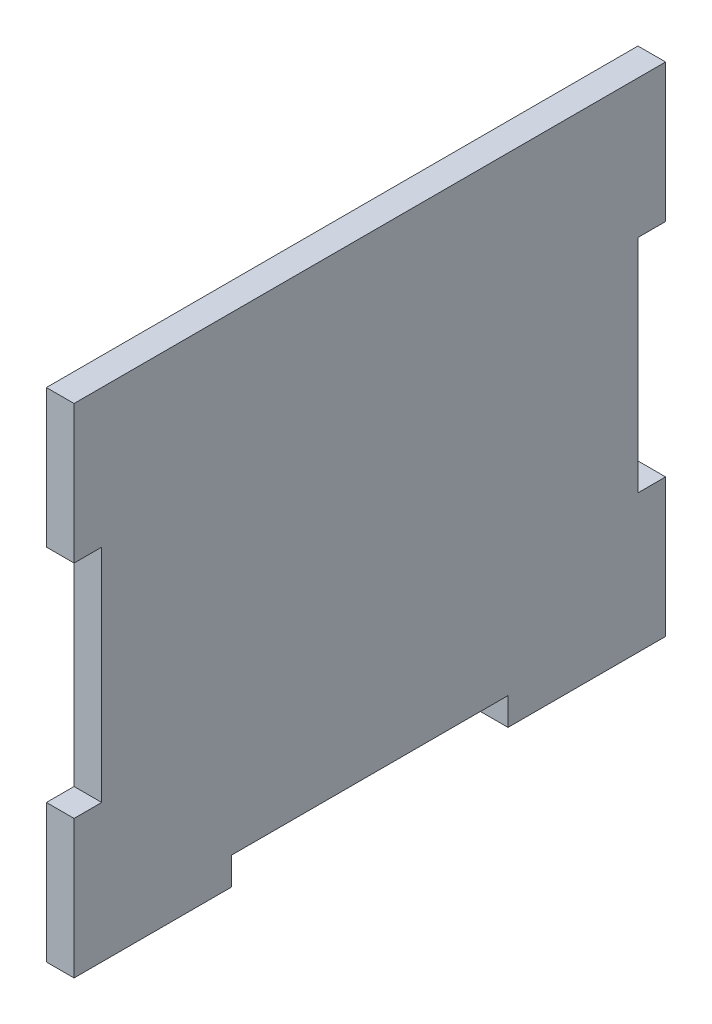
ISO-10303-21;
HEADER;
FILE_DESCRIPTION(('STEP AP214'),'2;1');
FILE_NAME('part.step','',(''),(''),'','','');
FILE_SCHEMA(('AUTOMOTIVE_DESIGN { 1 0 10303 214 1 1 1 1 }'));
ENDSEC;
DATA;
#1=APPLICATION_CONTEXT('core data for automotive mechanical design processes');
#2=APPLICATION_PROTOCOL_DEFINITION('international standard','automotive_design',2000,#1);
#3=PRODUCT_CONTEXT('',#1,'mechanical');
#4=PRODUCT('Part','Part','',(#3));
#5=PRODUCT_RELATED_PRODUCT_CATEGORY('part','',(#4));
#6=PRODUCT_DEFINITION_FORMATION('','',#4);
#7=PRODUCT_DEFINITION_CONTEXT('part definition',#1,'design');
#8=PRODUCT_DEFINITION('design','',#6,#7);
#9=PRODUCT_DEFINITION_SHAPE('','',#8);
#10=(LENGTH_UNIT() NAMED_UNIT(*) SI_UNIT(.MILLI.,.METRE.));
#11=(NAMED_UNIT(*) PLANE_ANGLE_UNIT() SI_UNIT($,.RADIAN.));
#12=(NAMED_UNIT(*) SI_UNIT($,.STERADIAN.) SOLID_ANGLE_UNIT());
#13=UNCERTAINTY_MEASURE_WITH_UNIT(LENGTH_MEASURE(1.E-05),#10,'distance_accuracy_value','');
#14=(GEOMETRIC_REPRESENTATION_CONTEXT(3) GLOBAL_UNCERTAINTY_ASSIGNED_CONTEXT((#13)) GLOBAL_UNIT_ASSIGNED_CONTEXT((#10,
#11,#12)) REPRESENTATION_CONTEXT('',''));
#15=CARTESIAN_POINT('',(0.,0.,0.));
#16=DIRECTION('',(0.,0.,1.));
#17=DIRECTION('',(1.,0.,0.));
#18=AXIS2_PLACEMENT_3D('',#15,#16,#17);
#19=CARTESIAN_POINT('',(5.,0.,0.));
#20=DIRECTION('',(0.,0.,-1.));
#21=DIRECTION('',(-1.,0.,0.));
#22=AXIS2_PLACEMENT_3D('',#19,#20,#21);
#23=PLANE('',#22);
#24=DIRECTION('',(0.,-1.,0.));
#25=VECTOR('',#24,1.);
#26=CARTESIAN_POINT('',(5.,0.,0.));
#27=LINE('',#26,#25);
#28=CARTESIAN_POINT('',(5.,25.,0.));
#29=VERTEX_POINT('',#28);
#30=CARTESIAN_POINT('',(5.,0.,0.));
#31=VERTEX_POINT('',#30);
#32=EDGE_CURVE('E290',#29,#31,#27,.T.);
#33=ORIENTED_EDGE('',*,*,#32,.F.);
#34=DIRECTION('',(-1.,0.,0.));
#35=VECTOR('',#34,1.);
#36=CARTESIAN_POINT('',(5.,25.,0.));
#37=LINE('',#36,#35);
#38=CARTESIAN_POINT('',(0.,25.,0.));
#39=VERTEX_POINT('',#38);
#40=EDGE_CURVE('E227',#29,#39,#37,.T.);
#41=ORIENTED_EDGE('',*,*,#40,.T.);
#42=DIRECTION('',(0.,-1.,0.));
#43=VECTOR('',#42,1.);
#44=CARTESIAN_POINT('',(0.,0.,0.));
#45=LINE('',#44,#43);
#46=CARTESIAN_POINT('',(0.,0.,0.));
#47=VERTEX_POINT('',#46);
#48=EDGE_CURVE('E280',#39,#47,#45,.T.);
#49=ORIENTED_EDGE('',*,*,#48,.T.);
#50=DIRECTION('',(-1.,0.,0.));
#51=VECTOR('',#50,1.);
#52=CARTESIAN_POINT('',(5.,0.,0.));
#53=LINE('',#52,#51);
#54=EDGE_CURVE('E11',#31,#47,#53,.T.);
#55=ORIENTED_EDGE('',*,*,#54,.F.);
#56=EDGE_LOOP('',(#33,#41,#49,#55));
#57=FACE_BOUND('',#56,.T.);
#58=ADVANCED_FACE('F33',(#57),#23,.F.);
#59=CARTESIAN_POINT('',(5.,0.,0.));
#60=DIRECTION('',(0.,1.,0.));
#61=DIRECTION('',(0.,0.,1.));
#62=AXIS2_PLACEMENT_3D('',#59,#60,#61);
#63=PLANE('',#62);
#64=DIRECTION('',(0.,0.,-1.));
#65=VECTOR('',#64,1.);
#66=CARTESIAN_POINT('',(5.,0.,0.));
#67=LINE('',#66,#65);
#68=CARTESIAN_POINT('',(5.,0.,-78.5));
#69=VERTEX_POINT('',#68);
#70=CARTESIAN_POINT('',(5.,0.,-107.));
#71=VERTEX_POINT('',#70);
#72=EDGE_CURVE('E289',#69,#71,#67,.T.);
#73=ORIENTED_EDGE('',*,*,#72,.F.);
#74=DIRECTION('',(-1.,0.,0.));
#75=VECTOR('',#74,1.);
#76=CARTESIAN_POINT('',(5.,0.,-78.5));
#77=LINE('',#76,#75);
#78=CARTESIAN_POINT('',(0.,0.,-78.5));
#79=VERTEX_POINT('',#78);
#80=EDGE_CURVE('E246',#69,#79,#77,.T.);
#81=ORIENTED_EDGE('',*,*,#80,.T.);
#82=DIRECTION('',(0.,0.,-1.));
#83=VECTOR('',#82,1.);
#84=CARTESIAN_POINT('',(0.,0.,0.));
#85=LINE('',#84,#83);
#86=CARTESIAN_POINT('',(0.,0.,-107.));
#87=VERTEX_POINT('',#86);
#88=EDGE_CURVE('E304',#79,#87,#85,.T.);
#89=ORIENTED_EDGE('',*,*,#88,.T.);
#90=DIRECTION('',(-1.,0.,0.));
#91=VECTOR('',#90,1.);
#92=CARTESIAN_POINT('',(5.,0.,-107.));
#93=LINE('',#92,#91);
#94=EDGE_CURVE('E41',#71,#87,#93,.T.);
#95=ORIENTED_EDGE('',*,*,#94,.F.);
#96=EDGE_LOOP('',(#73,#81,#89,#95));
#97=FACE_BOUND('',#96,.T.);
#98=ADVANCED_FACE('F341',(#97),#63,.F.);
#99=CARTESIAN_POINT('',(5.,0.,-107.));
#100=DIRECTION('',(0.,0.,1.));
#101=DIRECTION('',(1.,0.,0.));
#102=AXIS2_PLACEMENT_3D('',#99,#100,#101);
#103=PLANE('',#102);
#104=DIRECTION('',(0.,1.,0.));
#105=VECTOR('',#104,1.);
#106=CARTESIAN_POINT('',(5.,0.,-107.));
#107=LINE('',#106,#105);
#108=CARTESIAN_POINT('',(5.,65.,-107.));
#109=VERTEX_POINT('',#108);
#110=CARTESIAN_POINT('',(5.,90.,-107.));
#111=VERTEX_POINT('',#110);
#112=EDGE_CURVE('E294',#109,#111,#107,.T.);
#113=ORIENTED_EDGE('',*,*,#112,.F.);
#114=DIRECTION('',(-1.,0.,0.));
#115=VECTOR('',#114,1.);
#116=CARTESIAN_POINT('',(5.,65.,-107.));
#117=LINE('',#116,#115);
#118=CARTESIAN_POINT('',(0.,65.,-107.));
#119=VERTEX_POINT('',#118);
#120=EDGE_CURVE('E277',#109,#119,#117,.T.);
#121=ORIENTED_EDGE('',*,*,#120,.T.);
#122=DIRECTION('',(0.,1.,0.));
#123=VECTOR('',#122,1.);
#124=CARTESIAN_POINT('',(0.,0.,-107.));
#125=LINE('',#124,#123);
#126=CARTESIAN_POINT('',(0.,90.,-107.));
#127=VERTEX_POINT('',#126);
#128=EDGE_CURVE('E308',#119,#127,#125,.T.);
#129=ORIENTED_EDGE('',*,*,#128,.T.);
#130=DIRECTION('',(-1.,0.,0.));
#131=VECTOR('',#130,1.);
#132=CARTESIAN_POINT('',(5.,90.,-107.));
#133=LINE('',#132,#131);
#134=EDGE_CURVE('E316',#111,#127,#133,.T.);
#135=ORIENTED_EDGE('',*,*,#134,.F.);
#136=EDGE_LOOP('',(#113,#121,#129,#135));
#137=FACE_BOUND('',#136,.T.);
#138=ADVANCED_FACE('F380',(#137),#103,.F.);
#139=CARTESIAN_POINT('',(0.,90.,0.));
#140=VERTEX_POINT('',#139);
#141=CARTESIAN_POINT('',(0.,65.,0.));
#142=VERTEX_POINT('',#141);
#143=EDGE_CURVE('E301',#140,#142,#45,.T.);
#144=ORIENTED_EDGE('',*,*,#143,.T.);
#145=DIRECTION('',(-1.,0.,0.));
#146=VECTOR('',#145,1.);
#147=CARTESIAN_POINT('',(5.,65.,0.));
#148=LINE('',#147,#146);
#149=CARTESIAN_POINT('',(5.,65.,0.));
#150=VERTEX_POINT('',#149);
#151=EDGE_CURVE('E56',#150,#142,#148,.T.);
#152=ORIENTED_EDGE('',*,*,#151,.F.);
#153=CARTESIAN_POINT('',(5.,90.,0.));
#154=VERTEX_POINT('',#153);
#155=EDGE_CURVE('E286',#154,#150,#27,.T.);
#156=ORIENTED_EDGE('',*,*,#155,.F.);
#157=DIRECTION('',(-1.,0.,0.));
#158=VECTOR('',#157,1.);
#159=CARTESIAN_POINT('',(5.,90.,0.));
#160=LINE('',#159,#158);
#161=EDGE_CURVE('E300',#154,#140,#160,.T.);
#162=ORIENTED_EDGE('',*,*,#161,.T.);
#163=EDGE_LOOP('',(#144,#152,#156,#162));
#164=FACE_BOUND('',#163,.T.);
#165=ADVANCED_FACE('F35',(#164),#23,.F.);
#166=CARTESIAN_POINT('',(0.,0.,-28.5));
#167=VERTEX_POINT('',#166);
#168=EDGE_CURVE('E305',#47,#167,#85,.T.);
#169=ORIENTED_EDGE('',*,*,#168,.T.);
#170=DIRECTION('',(-1.,0.,0.));
#171=VECTOR('',#170,1.);
#172=CARTESIAN_POINT('',(5.,0.,-28.5));
#173=LINE('',#172,#171);
#174=CARTESIAN_POINT('',(5.,0.,-28.5));
#175=VERTEX_POINT('',#174);
#176=EDGE_CURVE('E256',#175,#167,#173,.T.);
#177=ORIENTED_EDGE('',*,*,#176,.F.);
#178=EDGE_CURVE('E291',#31,#175,#67,.T.);
#179=ORIENTED_EDGE('',*,*,#178,.F.);
#180=ORIENTED_EDGE('',*,*,#54,.T.);
#181=EDGE_LOOP('',(#169,#177,#179,#180));
#182=FACE_BOUND('',#181,.T.);
#183=ADVANCED_FACE('F355',(#182),#63,.F.);
#184=CARTESIAN_POINT('',(0.,25.,-107.));
#185=VERTEX_POINT('',#184);
#186=EDGE_CURVE('E309',#87,#185,#125,.T.);
#187=ORIENTED_EDGE('',*,*,#186,.T.);
#188=DIRECTION('',(-1.,0.,0.));
#189=VECTOR('',#188,1.);
#190=CARTESIAN_POINT('',(5.,25.,-107.));
#191=LINE('',#190,#189);
#192=CARTESIAN_POINT('',(5.,25.,-107.));
#193=VERTEX_POINT('',#192);
#194=EDGE_CURVE('E270',#193,#185,#191,.T.);
#195=ORIENTED_EDGE('',*,*,#194,.F.);
#196=EDGE_CURVE('E295',#71,#193,#107,.T.);
#197=ORIENTED_EDGE('',*,*,#196,.F.);
#198=ORIENTED_EDGE('',*,*,#94,.T.);
#199=EDGE_LOOP('',(#187,#195,#197,#198));
#200=FACE_BOUND('',#199,.T.);
#201=ADVANCED_FACE('F323',(#200),#103,.F.);
#202=CARTESIAN_POINT('',(5.,90.,0.));
#203=DIRECTION('',(0.,-1.,0.));
#204=DIRECTION('',(0.,0.,-1.));
#205=AXIS2_PLACEMENT_3D('',#202,#203,#204);
#206=PLANE('',#205);
#207=DIRECTION('',(0.,0.,1.));
#208=VECTOR('',#207,1.);
#209=CARTESIAN_POINT('',(0.,90.,0.));
#210=LINE('',#209,#208);
#211=EDGE_CURVE('E312',#127,#140,#210,.T.);
#212=ORIENTED_EDGE('',*,*,#211,.T.);
#213=ORIENTED_EDGE('',*,*,#161,.F.);
#214=DIRECTION('',(0.,0.,1.));
#215=VECTOR('',#214,1.);
#216=CARTESIAN_POINT('',(5.,90.,0.));
#217=LINE('',#216,#215);
#218=EDGE_CURVE('E298',#111,#154,#217,.T.);
#219=ORIENTED_EDGE('',*,*,#218,.F.);
#220=ORIENTED_EDGE('',*,*,#134,.T.);
#221=EDGE_LOOP('',(#212,#213,#219,#220));
#222=FACE_BOUND('',#221,.T.);
#223=ADVANCED_FACE('F375',(#222),#206,.F.);
#224=CARTESIAN_POINT('',(5.,0.,0.));
#225=DIRECTION('',(-1.,0.,0.));
#226=DIRECTION('',(0.,0.,1.));
#227=AXIS2_PLACEMENT_3D('',#224,#225,#226);
#228=PLANE('',#227);
#229=DIRECTION('',(0.,-1.,0.));
#230=VECTOR('',#229,1.);
#231=CARTESIAN_POINT('',(5.,65.,-5.));
#232=LINE('',#231,#230);
#233=CARTESIAN_POINT('',(5.,65.,-5.));
#234=VERTEX_POINT('',#233);
#235=CARTESIAN_POINT('',(5.,25.,-4.99999999999999));
#236=VERTEX_POINT('',#235);
#237=EDGE_CURVE('E213',#234,#236,#232,.T.);
#238=ORIENTED_EDGE('',*,*,#237,.T.);
#239=DIRECTION('',(0.,0.,1.));
#240=VECTOR('',#239,1.);
#241=CARTESIAN_POINT('',(5.,25.,0.));
#242=LINE('',#241,#240);
#243=EDGE_CURVE('E217',#236,#29,#242,.T.);
#244=ORIENTED_EDGE('',*,*,#243,.T.);
#245=ORIENTED_EDGE('',*,*,#32,.T.);
#246=ORIENTED_EDGE('',*,*,#178,.T.);
#247=DIRECTION('',(0.,1.,0.));
#248=VECTOR('',#247,1.);
#249=CARTESIAN_POINT('',(5.,0.,-28.5));
#250=LINE('',#249,#248);
#251=CARTESIAN_POINT('',(5.,5.,-28.5));
#252=VERTEX_POINT('',#251);
#253=EDGE_CURVE('E239',#175,#252,#250,.T.);
#254=ORIENTED_EDGE('',*,*,#253,.T.);
#255=DIRECTION('',(0.,0.,-1.));
#256=VECTOR('',#255,1.);
#257=CARTESIAN_POINT('',(5.,5.,-78.5));
#258=LINE('',#257,#256);
#259=CARTESIAN_POINT('',(5.,5.,-78.5));
#260=VERTEX_POINT('',#259);
#261=EDGE_CURVE('E243',#252,#260,#258,.T.);
#262=ORIENTED_EDGE('',*,*,#261,.T.);
#263=DIRECTION('',(0.,-1.,0.));
#264=VECTOR('',#263,1.);
#265=CARTESIAN_POINT('',(5.,0.,-78.5));
#266=LINE('',#265,#264);
#267=EDGE_CURVE('E236',#260,#69,#266,.T.);
#268=ORIENTED_EDGE('',*,*,#267,.T.);
#269=ORIENTED_EDGE('',*,*,#72,.T.);
#270=ORIENTED_EDGE('',*,*,#196,.T.);
#271=DIRECTION('',(0.,0.,1.));
#272=VECTOR('',#271,1.);
#273=CARTESIAN_POINT('',(5.,25.,-107.));
#274=LINE('',#273,#272);
#275=CARTESIAN_POINT('',(5.,25.,-102.));
#276=VERTEX_POINT('',#275);
#277=EDGE_CURVE('E260',#193,#276,#274,.T.);
#278=ORIENTED_EDGE('',*,*,#277,.T.);
#279=DIRECTION('',(0.,1.,0.));
#280=VECTOR('',#279,1.);
#281=CARTESIAN_POINT('',(5.,65.,-102.));
#282=LINE('',#281,#280);
#283=CARTESIAN_POINT('',(5.,65.,-102.));
#284=VERTEX_POINT('',#283);
#285=EDGE_CURVE('E263',#276,#284,#282,.T.);
#286=ORIENTED_EDGE('',*,*,#285,.T.);
#287=DIRECTION('',(0.,0.,-1.));
#288=VECTOR('',#287,1.);
#289=CARTESIAN_POINT('',(5.,65.,-107.));
#290=LINE('',#289,#288);
#291=EDGE_CURVE('E267',#284,#109,#290,.T.);
#292=ORIENTED_EDGE('',*,*,#291,.T.);
#293=ORIENTED_EDGE('',*,*,#112,.T.);
#294=ORIENTED_EDGE('',*,*,#218,.T.);
#295=ORIENTED_EDGE('',*,*,#155,.T.);
#296=DIRECTION('',(0.,0.,-1.));
#297=VECTOR('',#296,1.);
#298=CARTESIAN_POINT('',(5.,65.,0.));
#299=LINE('',#298,#297);
#300=EDGE_CURVE('E210',#150,#234,#299,.T.);
#301=ORIENTED_EDGE('',*,*,#300,.T.);
#302=EDGE_LOOP('',(#238,#244,#245,#246,#254,#262,#268,#269,#270,#278,#286,#292,#293,#294,#295,#301));
#303=FACE_BOUND('',#302,.T.);
#304=ADVANCED_FACE('F339',(#303),#228,.F.);
#305=CARTESIAN_POINT('',(0.,0.,0.));
#306=DIRECTION('',(-1.,0.,0.));
#307=DIRECTION('',(0.,0.,1.));
#308=AXIS2_PLACEMENT_3D('',#305,#306,#307);
#309=PLANE('',#308);
#310=DIRECTION('',(0.,-1.,0.));
#311=VECTOR('',#310,1.);
#312=CARTESIAN_POINT('',(0.,87.5,-104.5));
#313=LINE('',#312,#311);
#314=CARTESIAN_POINT('',(0.,87.5,-104.5));
#315=VERTEX_POINT('',#314);
#316=CARTESIAN_POINT('',(0.,84.5,-104.5));
#317=VERTEX_POINT('',#316);
#318=EDGE_CURVE('E48',#315,#317,#313,.T.);
#319=ORIENTED_EDGE('',*,*,#318,.F.);
#320=DIRECTION('',(0.,0.,-1.));
#321=VECTOR('',#320,1.);
#322=CARTESIAN_POINT('',(0.,87.5,-104.5));
#323=LINE('',#322,#321);
#324=CARTESIAN_POINT('',(0.,87.5,-2.5));
#325=VERTEX_POINT('',#324);
#326=EDGE_CURVE('E191',#325,#315,#323,.T.);
#327=ORIENTED_EDGE('',*,*,#326,.F.);
#328=DIRECTION('',(0.,1.,0.));
#329=VECTOR('',#328,1.);
#330=CARTESIAN_POINT('',(0.,87.5,-2.5));
#331=LINE('',#330,#329);
#332=CARTESIAN_POINT('',(0.,84.5,-2.5));
#333=VERTEX_POINT('',#332);
#334=EDGE_CURVE('E194',#333,#325,#331,.T.);
#335=ORIENTED_EDGE('',*,*,#334,.F.);
#336=DIRECTION('',(0.,0.,1.));
#337=VECTOR('',#336,1.);
#338=CARTESIAN_POINT('',(0.,84.5,-104.5));
#339=LINE('',#338,#337);
#340=EDGE_CURVE('E200',#317,#333,#339,.T.);
#341=ORIENTED_EDGE('',*,*,#340,.F.);
#342=EDGE_LOOP('',(#319,#327,#335,#341));
#343=FACE_BOUND('',#342,.T.);
#344=DIRECTION('',(0.,0.,1.));
#345=VECTOR('',#344,1.);
#346=CARTESIAN_POINT('',(0.,25.,0.));
#347=LINE('',#346,#345);
#348=CARTESIAN_POINT('',(0.,25.,-4.99999999999999));
#349=VERTEX_POINT('',#348);
#350=EDGE_CURVE('E214',#349,#39,#347,.T.);
#351=ORIENTED_EDGE('',*,*,#350,.F.);
#352=DIRECTION('',(0.,-1.,0.));
#353=VECTOR('',#352,1.);
#354=CARTESIAN_POINT('',(0.,65.,-5.));
#355=LINE('',#354,#353);
#356=CARTESIAN_POINT('',(0.,65.,-5.));
#357=VERTEX_POINT('',#356);
#358=EDGE_CURVE('E222',#357,#349,#355,.T.);
#359=ORIENTED_EDGE('',*,*,#358,.F.);
#360=DIRECTION('',(0.,0.,-1.));
#361=VECTOR('',#360,1.);
#362=CARTESIAN_POINT('',(0.,65.,0.));
#363=LINE('',#362,#361);
#364=EDGE_CURVE('E220',#142,#357,#363,.T.);
#365=ORIENTED_EDGE('',*,*,#364,.F.);
#366=ORIENTED_EDGE('',*,*,#143,.F.);
#367=ORIENTED_EDGE('',*,*,#211,.F.);
#368=ORIENTED_EDGE('',*,*,#128,.F.);
#369=DIRECTION('',(0.,0.,-1.));
#370=VECTOR('',#369,1.);
#371=CARTESIAN_POINT('',(0.,65.,-107.));
#372=LINE('',#371,#370);
#373=CARTESIAN_POINT('',(0.,65.,-102.));
#374=VERTEX_POINT('',#373);
#375=EDGE_CURVE('E264',#374,#119,#372,.T.);
#376=ORIENTED_EDGE('',*,*,#375,.F.);
#377=DIRECTION('',(0.,1.,0.));
#378=VECTOR('',#377,1.);
#379=CARTESIAN_POINT('',(0.,65.,-102.));
#380=LINE('',#379,#378);
#381=CARTESIAN_POINT('',(0.,25.,-102.));
#382=VERTEX_POINT('',#381);
#383=EDGE_CURVE('E273',#382,#374,#380,.T.);
#384=ORIENTED_EDGE('',*,*,#383,.F.);
#385=DIRECTION('',(0.,0.,1.));
#386=VECTOR('',#385,1.);
#387=CARTESIAN_POINT('',(0.,25.,-107.));
#388=LINE('',#387,#386);
#389=EDGE_CURVE('E230',#185,#382,#388,.T.);
#390=ORIENTED_EDGE('',*,*,#389,.F.);
#391=ORIENTED_EDGE('',*,*,#186,.F.);
#392=ORIENTED_EDGE('',*,*,#88,.F.);
#393=DIRECTION('',(0.,-1.,0.));
#394=VECTOR('',#393,1.);
#395=CARTESIAN_POINT('',(0.,0.,-78.5));
#396=LINE('',#395,#394);
#397=CARTESIAN_POINT('',(0.,5.,-78.5));
#398=VERTEX_POINT('',#397);
#399=EDGE_CURVE('E206',#398,#79,#396,.T.);
#400=ORIENTED_EDGE('',*,*,#399,.F.);
#401=DIRECTION('',(0.,0.,-1.));
#402=VECTOR('',#401,1.);
#403=CARTESIAN_POINT('',(0.,5.,-78.5));
#404=LINE('',#403,#402);
#405=CARTESIAN_POINT('',(0.,5.,-28.5));
#406=VERTEX_POINT('',#405);
#407=EDGE_CURVE('E240',#406,#398,#404,.T.);
#408=ORIENTED_EDGE('',*,*,#407,.F.);
#409=DIRECTION('',(0.,1.,0.));
#410=VECTOR('',#409,1.);
#411=CARTESIAN_POINT('',(0.,0.,-28.5));
#412=LINE('',#411,#410);
#413=EDGE_CURVE('E248',#167,#406,#412,.T.);
#414=ORIENTED_EDGE('',*,*,#413,.F.);
#415=ORIENTED_EDGE('',*,*,#168,.F.);
#416=ORIENTED_EDGE('',*,*,#48,.F.);
#417=EDGE_LOOP('',(#351,#359,#365,#366,#367,#368,#376,#384,#390,#391,#392,#400,#408,#414,#415,#416));
#418=FACE_BOUND('',#417,.T.);
#419=ADVANCED_FACE('F331',(#343,#418),#309,.T.);
#420=CARTESIAN_POINT('',(5.,65.,-107.));
#421=DIRECTION('',(0.,1.,0.));
#422=DIRECTION('',(0.,0.,1.));
#423=AXIS2_PLACEMENT_3D('',#420,#421,#422);
#424=PLANE('',#423);
#425=ORIENTED_EDGE('',*,*,#375,.T.);
#426=ORIENTED_EDGE('',*,*,#120,.F.);
#427=ORIENTED_EDGE('',*,*,#291,.F.);
#428=DIRECTION('',(-1.,0.,0.));
#429=VECTOR('',#428,1.);
#430=CARTESIAN_POINT('',(5.,65.,-102.));
#431=LINE('',#430,#429);
#432=EDGE_CURVE('E281',#284,#374,#431,.T.);
#433=ORIENTED_EDGE('',*,*,#432,.T.);
#434=EDGE_LOOP('',(#425,#426,#427,#433));
#435=FACE_BOUND('',#434,.T.);
#436=ADVANCED_FACE('F383',(#435),#424,.F.);
#437=CARTESIAN_POINT('',(5.,65.,-102.));
#438=DIRECTION('',(0.,0.,1.));
#439=DIRECTION('',(0.,-1.,0.));
#440=AXIS2_PLACEMENT_3D('',#437,#438,#439);
#441=PLANE('',#440);
#442=ORIENTED_EDGE('',*,*,#383,.T.);
#443=ORIENTED_EDGE('',*,*,#432,.F.);
#444=ORIENTED_EDGE('',*,*,#285,.F.);
#445=DIRECTION('',(-1.,0.,0.));
#446=VECTOR('',#445,1.);
#447=CARTESIAN_POINT('',(5.,25.,-102.));
#448=LINE('',#447,#446);
#449=EDGE_CURVE('E283',#276,#382,#448,.T.);
#450=ORIENTED_EDGE('',*,*,#449,.T.);
#451=EDGE_LOOP('',(#442,#443,#444,#450));
#452=FACE_BOUND('',#451,.T.);
#453=ADVANCED_FACE('F385',(#452),#441,.F.);
#454=CARTESIAN_POINT('',(5.,25.,-107.));
#455=DIRECTION('',(0.,-1.,0.));
#456=DIRECTION('',(0.,0.,-1.));
#457=AXIS2_PLACEMENT_3D('',#454,#455,#456);
#458=PLANE('',#457);
#459=ORIENTED_EDGE('',*,*,#389,.T.);
#460=ORIENTED_EDGE('',*,*,#449,.F.);
#461=ORIENTED_EDGE('',*,*,#277,.F.);
#462=ORIENTED_EDGE('',*,*,#194,.T.);
#463=EDGE_LOOP('',(#459,#460,#461,#462));
#464=FACE_BOUND('',#463,.T.);
#465=ADVANCED_FACE('F336',(#464),#458,.F.);
#466=CARTESIAN_POINT('',(5.,0.,-78.5));
#467=DIRECTION('',(0.,0.,-1.));
#468=DIRECTION('',(-1.,0.,0.));
#469=AXIS2_PLACEMENT_3D('',#466,#467,#468);
#470=PLANE('',#469);
#471=ORIENTED_EDGE('',*,*,#399,.T.);
#472=ORIENTED_EDGE('',*,*,#80,.F.);
#473=ORIENTED_EDGE('',*,*,#267,.F.);
#474=DIRECTION('',(-1.,0.,0.));
#475=VECTOR('',#474,1.);
#476=CARTESIAN_POINT('',(5.,5.,-78.5));
#477=LINE('',#476,#475);
#478=EDGE_CURVE('E223',#260,#398,#477,.T.);
#479=ORIENTED_EDGE('',*,*,#478,.T.);
#480=EDGE_LOOP('',(#471,#472,#473,#479));
#481=FACE_BOUND('',#480,.T.);
#482=ADVANCED_FACE('F343',(#481),#470,.F.);
#483=CARTESIAN_POINT('',(5.,5.,-78.5));
#484=DIRECTION('',(0.,1.,0.));
#485=DIRECTION('',(0.,0.,1.));
#486=AXIS2_PLACEMENT_3D('',#483,#484,#485);
#487=PLANE('',#486);
#488=ORIENTED_EDGE('',*,*,#407,.T.);
#489=ORIENTED_EDGE('',*,*,#478,.F.);
#490=ORIENTED_EDGE('',*,*,#261,.F.);
#491=DIRECTION('',(-1.,0.,0.));
#492=VECTOR('',#491,1.);
#493=CARTESIAN_POINT('',(5.,5.,-28.5));
#494=LINE('',#493,#492);
#495=EDGE_CURVE('E254',#252,#406,#494,.T.);
#496=ORIENTED_EDGE('',*,*,#495,.T.);
#497=EDGE_LOOP('',(#488,#489,#490,#496));
#498=FACE_BOUND('',#497,.T.);
#499=ADVANCED_FACE('F348',(#498),#487,.F.);
#500=CARTESIAN_POINT('',(5.,0.,-28.5));
#501=DIRECTION('',(0.,0.,1.));
#502=DIRECTION('',(1.,0.,0.));
#503=AXIS2_PLACEMENT_3D('',#500,#501,#502);
#504=PLANE('',#503);
#505=ORIENTED_EDGE('',*,*,#413,.T.);
#506=ORIENTED_EDGE('',*,*,#495,.F.);
#507=ORIENTED_EDGE('',*,*,#253,.F.);
#508=ORIENTED_EDGE('',*,*,#176,.T.);
#509=EDGE_LOOP('',(#505,#506,#507,#508));
#510=FACE_BOUND('',#509,.T.);
#511=ADVANCED_FACE('F351',(#510),#504,.F.);
#512=CARTESIAN_POINT('',(5.,25.,0.));
#513=DIRECTION('',(0.,-1.,0.));
#514=DIRECTION('',(0.,0.,-1.));
#515=AXIS2_PLACEMENT_3D('',#512,#513,#514);
#516=PLANE('',#515);
#517=ORIENTED_EDGE('',*,*,#350,.T.);
#518=ORIENTED_EDGE('',*,*,#40,.F.);
#519=ORIENTED_EDGE('',*,*,#243,.F.);
#520=DIRECTION('',(-1.,0.,0.));
#521=VECTOR('',#520,1.);
#522=CARTESIAN_POINT('',(5.,25.,-4.99999999999999));
#523=LINE('',#522,#521);
#524=EDGE_CURVE('E231',#236,#349,#523,.T.);
#525=ORIENTED_EDGE('',*,*,#524,.T.);
#526=EDGE_LOOP('',(#517,#518,#519,#525));
#527=FACE_BOUND('',#526,.T.);
#528=ADVANCED_FACE('F363',(#527),#516,.F.);
#529=CARTESIAN_POINT('',(5.,65.,-5.));
#530=DIRECTION('',(0.,0.,-1.));
#531=DIRECTION('',(0.,1.,0.));
#532=AXIS2_PLACEMENT_3D('',#529,#530,#531);
#533=PLANE('',#532);
#534=ORIENTED_EDGE('',*,*,#358,.T.);
#535=ORIENTED_EDGE('',*,*,#524,.F.);
#536=ORIENTED_EDGE('',*,*,#237,.F.);
#537=DIRECTION('',(-1.,0.,0.));
#538=VECTOR('',#537,1.);
#539=CARTESIAN_POINT('',(5.,65.,-5.));
#540=LINE('',#539,#538);
#541=EDGE_CURVE('E233',#234,#357,#540,.T.);
#542=ORIENTED_EDGE('',*,*,#541,.T.);
#543=EDGE_LOOP('',(#534,#535,#536,#542));
#544=FACE_BOUND('',#543,.T.);
#545=ADVANCED_FACE('F366',(#544),#533,.F.);
#546=CARTESIAN_POINT('',(5.,65.,0.));
#547=DIRECTION('',(0.,1.,0.));
#548=DIRECTION('',(0.,0.,1.));
#549=AXIS2_PLACEMENT_3D('',#546,#547,#548);
#550=PLANE('',#549);
#551=ORIENTED_EDGE('',*,*,#364,.T.);
#552=ORIENTED_EDGE('',*,*,#541,.F.);
#553=ORIENTED_EDGE('',*,*,#300,.F.);
#554=ORIENTED_EDGE('',*,*,#151,.T.);
#555=EDGE_LOOP('',(#551,#552,#553,#554));
#556=FACE_BOUND('',#555,.T.);
#557=ADVANCED_FACE('F367',(#556),#550,.F.);
#558=CARTESIAN_POINT('',(2.5,87.5,-104.5));
#559=DIRECTION('',(0.,0.,-1.));
#560=DIRECTION('',(0.,1.,0.));
#561=AXIS2_PLACEMENT_3D('',#558,#559,#560);
#562=PLANE('',#561);
#563=ORIENTED_EDGE('',*,*,#318,.T.);
#564=DIRECTION('',(-1.,0.,0.));
#565=VECTOR('',#564,1.);
#566=CARTESIAN_POINT('',(2.5,84.5,-104.5));
#567=LINE('',#566,#565);
#568=CARTESIAN_POINT('',(2.5,84.5,-104.5));
#569=VERTEX_POINT('',#568);
#570=EDGE_CURVE('E169',#569,#317,#567,.T.);
#571=ORIENTED_EDGE('',*,*,#570,.F.);
#572=DIRECTION('',(0.,-1.,0.));
#573=VECTOR('',#572,1.);
#574=CARTESIAN_POINT('',(2.5,87.5,-104.5));
#575=LINE('',#574,#573);
#576=CARTESIAN_POINT('',(2.5,87.5,-104.5));
#577=VERTEX_POINT('',#576);
#578=EDGE_CURVE('E173',#577,#569,#575,.T.);
#579=ORIENTED_EDGE('',*,*,#578,.F.);
#580=DIRECTION('',(-1.,0.,0.));
#581=VECTOR('',#580,1.);
#582=CARTESIAN_POINT('',(2.5,87.5,-104.5));
#583=LINE('',#582,#581);
#584=EDGE_CURVE('E204',#577,#315,#583,.T.);
#585=ORIENTED_EDGE('',*,*,#584,.T.);
#586=EDGE_LOOP('',(#563,#571,#579,#585));
#587=FACE_BOUND('',#586,.T.);
#588=ADVANCED_FACE('F171',(#587),#562,.F.);
#589=CARTESIAN_POINT('',(2.5,87.5,-104.5));
#590=DIRECTION('',(0.,1.,0.));
#591=DIRECTION('',(0.,0.,1.));
#592=AXIS2_PLACEMENT_3D('',#589,#590,#591);
#593=PLANE('',#592);
#594=ORIENTED_EDGE('',*,*,#326,.T.);
#595=ORIENTED_EDGE('',*,*,#584,.F.);
#596=DIRECTION('',(0.,0.,-1.));
#597=VECTOR('',#596,1.);
#598=CARTESIAN_POINT('',(2.5,87.5,-104.5));
#599=LINE('',#598,#597);
#600=CARTESIAN_POINT('',(2.5,87.5,-2.5));
#601=VERTEX_POINT('',#600);
#602=EDGE_CURVE('E179',#601,#577,#599,.T.);
#603=ORIENTED_EDGE('',*,*,#602,.F.);
#604=DIRECTION('',(-1.,0.,0.));
#605=VECTOR('',#604,1.);
#606=CARTESIAN_POINT('',(2.5,87.5,-2.5));
#607=LINE('',#606,#605);
#608=EDGE_CURVE('E207',#601,#325,#607,.T.);
#609=ORIENTED_EDGE('',*,*,#608,.T.);
#610=EDGE_LOOP('',(#594,#595,#603,#609));
#611=FACE_BOUND('',#610,.T.);
#612=ADVANCED_FACE('F425',(#611),#593,.F.);
#613=CARTESIAN_POINT('',(2.5,87.5,-2.5));
#614=DIRECTION('',(0.,0.,1.));
#615=DIRECTION('',(0.,-1.,0.));
#616=AXIS2_PLACEMENT_3D('',#613,#614,#615);
#617=PLANE('',#616);
#618=ORIENTED_EDGE('',*,*,#334,.T.);
#619=ORIENTED_EDGE('',*,*,#608,.F.);
#620=DIRECTION('',(0.,1.,0.));
#621=VECTOR('',#620,1.);
#622=CARTESIAN_POINT('',(2.5,87.5,-2.5));
#623=LINE('',#622,#621);
#624=CARTESIAN_POINT('',(2.5,84.5,-2.5));
#625=VERTEX_POINT('',#624);
#626=EDGE_CURVE('E187',#625,#601,#623,.T.);
#627=ORIENTED_EDGE('',*,*,#626,.F.);
#628=DIRECTION('',(-1.,0.,0.));
#629=VECTOR('',#628,1.);
#630=CARTESIAN_POINT('',(2.5,84.5,-2.5));
#631=LINE('',#630,#629);
#632=EDGE_CURVE('E178',#625,#333,#631,.T.);
#633=ORIENTED_EDGE('',*,*,#632,.T.);
#634=EDGE_LOOP('',(#618,#619,#627,#633));
#635=FACE_BOUND('',#634,.T.);
#636=ADVANCED_FACE('F423',(#635),#617,.F.);
#637=CARTESIAN_POINT('',(2.5,84.5,-104.5));
#638=DIRECTION('',(0.,-1.,0.));
#639=DIRECTION('',(0.,0.,-1.));
#640=AXIS2_PLACEMENT_3D('',#637,#638,#639);
#641=PLANE('',#640);
#642=ORIENTED_EDGE('',*,*,#340,.T.);
#643=ORIENTED_EDGE('',*,*,#632,.F.);
#644=DIRECTION('',(0.,0.,1.));
#645=VECTOR('',#644,1.);
#646=CARTESIAN_POINT('',(2.5,84.5,-104.5));
#647=LINE('',#646,#645);
#648=EDGE_CURVE('E182',#569,#625,#647,.T.);
#649=ORIENTED_EDGE('',*,*,#648,.F.);
#650=ORIENTED_EDGE('',*,*,#570,.T.);
#651=EDGE_LOOP('',(#642,#643,#649,#650));
#652=FACE_BOUND('',#651,.T.);
#653=ADVANCED_FACE('F183',(#652),#641,.F.);
#654=CARTESIAN_POINT('',(2.5,0.,0.));
#655=DIRECTION('',(-1.,0.,0.));
#656=DIRECTION('',(0.,0.,1.));
#657=AXIS2_PLACEMENT_3D('',#654,#655,#656);
#658=PLANE('',#657);
#659=ORIENTED_EDGE('',*,*,#578,.T.);
#660=ORIENTED_EDGE('',*,*,#648,.T.);
#661=ORIENTED_EDGE('',*,*,#626,.T.);
#662=ORIENTED_EDGE('',*,*,#602,.T.);
#663=EDGE_LOOP('',(#659,#660,#661,#662));
#664=FACE_BOUND('',#663,.T.);
#665=ADVANCED_FACE('F189',(#664),#658,.T.);
#666=CLOSED_SHELL('',(#58,#98,#138,#165,#183,#201,#223,#304,#419,#436,#453,#465,#482,#499,#511,
#528,#545,#557,#588,#612,#636,#653,#665));
#667=MANIFOLD_SOLID_BREP('B2',#666);
#668=ADVANCED_BREP_SHAPE_REPRESENTATION('',(#18,#667),#14);
#669=SHAPE_DEFINITION_REPRESENTATION(#9,#668);
ENDSEC;
END-ISO-10303-21;
